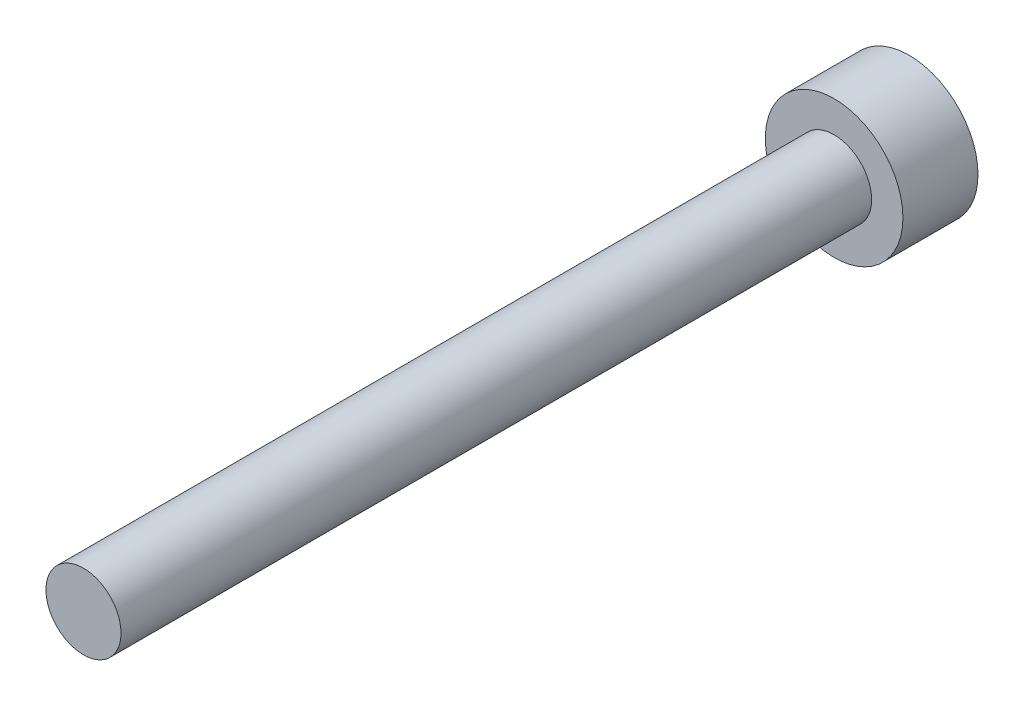
ISO-10303-21;
HEADER;
FILE_DESCRIPTION(('STEP AP214'),'2;1');
FILE_NAME('part.step','',(''),(''),'','','');
FILE_SCHEMA(('AUTOMOTIVE_DESIGN { 1 0 10303 214 1 1 1 1 }'));
ENDSEC;
DATA;
#1=APPLICATION_CONTEXT('core data for automotive mechanical design processes');
#2=APPLICATION_PROTOCOL_DEFINITION('international standard','automotive_design',2000,#1);
#3=PRODUCT_CONTEXT('',#1,'mechanical');
#4=PRODUCT('Part','Part','',(#3));
#5=PRODUCT_RELATED_PRODUCT_CATEGORY('part','',(#4));
#6=PRODUCT_DEFINITION_FORMATION('','',#4);
#7=PRODUCT_DEFINITION_CONTEXT('part definition',#1,'design');
#8=PRODUCT_DEFINITION('design','',#6,#7);
#9=PRODUCT_DEFINITION_SHAPE('','',#8);
#10=(LENGTH_UNIT() NAMED_UNIT(*) SI_UNIT(.MILLI.,.METRE.));
#11=(NAMED_UNIT(*) PLANE_ANGLE_UNIT() SI_UNIT($,.RADIAN.));
#12=(NAMED_UNIT(*) SI_UNIT($,.STERADIAN.) SOLID_ANGLE_UNIT());
#13=UNCERTAINTY_MEASURE_WITH_UNIT(LENGTH_MEASURE(1.E-05),#10,'distance_accuracy_value','');
#14=(GEOMETRIC_REPRESENTATION_CONTEXT(3) GLOBAL_UNCERTAINTY_ASSIGNED_CONTEXT((#13)) GLOBAL_UNIT_ASSIGNED_CONTEXT((#10,
#11,#12)) REPRESENTATION_CONTEXT('',''));
#15=CARTESIAN_POINT('',(0.,0.,0.));
#16=DIRECTION('',(0.,0.,1.));
#17=DIRECTION('',(1.,0.,0.));
#18=AXIS2_PLACEMENT_3D('',#15,#16,#17);
#19=CARTESIAN_POINT('',(0.,0.,-3.));
#20=DIRECTION('',(0.,0.,1.));
#21=DIRECTION('',(1.,0.,0.));
#22=AXIS2_PLACEMENT_3D('',#19,#20,#21);
#23=PLANE('',#22);
#24=CARTESIAN_POINT('',(0.,0.,-3.));
#25=DIRECTION('',(0.,0.,1.));
#26=DIRECTION('',(1.,0.,0.));
#27=AXIS2_PLACEMENT_3D('',#24,#25,#26);
#28=CIRCLE('',#27,2.75);
#29=CARTESIAN_POINT('',(2.75,0.,-3.));
#30=VERTEX_POINT('',#29);
#31=EDGE_CURVE('E111',#30,#30,#28,.T.);
#32=ORIENTED_EDGE('',*,*,#31,.F.);
#33=EDGE_LOOP('',(#32));
#34=FACE_BOUND('',#33,.T.);
#35=DIRECTION('',(-0.5,-0.866025403784439,0.));
#36=VECTOR('',#35,1.);
#37=CARTESIAN_POINT('',(1.08253175473055,-0.625,-3.));
#38=LINE('',#37,#36);
#39=CARTESIAN_POINT('',(1.44337567297406,0.,-3.));
#40=VERTEX_POINT('',#39);
#41=CARTESIAN_POINT('',(0.721687836487032,-1.25,-3.));
#42=VERTEX_POINT('',#41);
#43=EDGE_CURVE('E11',#40,#42,#38,.T.);
#44=ORIENTED_EDGE('',*,*,#43,.F.);
#45=DIRECTION('',(0.5,-0.866025403784439,0.));
#46=VECTOR('',#45,1.);
#47=CARTESIAN_POINT('',(1.08253175473055,0.625,-3.));
#48=LINE('',#47,#46);
#49=CARTESIAN_POINT('',(0.721687836487032,1.25,-3.));
#50=VERTEX_POINT('',#49);
#51=EDGE_CURVE('E50',#50,#40,#48,.T.);
#52=ORIENTED_EDGE('',*,*,#51,.F.);
#53=DIRECTION('',(1.,0.,0.));
#54=VECTOR('',#53,1.);
#55=CARTESIAN_POINT('',(0.,1.25,-3.));
#56=LINE('',#55,#54);
#57=CARTESIAN_POINT('',(-0.721687836487032,1.25,-3.));
#58=VERTEX_POINT('',#57);
#59=EDGE_CURVE('E132',#58,#50,#56,.T.);
#60=ORIENTED_EDGE('',*,*,#59,.F.);
#61=DIRECTION('',(0.5,0.866025403784439,0.));
#62=VECTOR('',#61,1.);
#63=CARTESIAN_POINT('',(-1.08253175473055,0.625,-3.));
#64=LINE('',#63,#62);
#65=CARTESIAN_POINT('',(-1.44337567297406,0.,-3.));
#66=VERTEX_POINT('',#65);
#67=EDGE_CURVE('E126',#66,#58,#64,.T.);
#68=ORIENTED_EDGE('',*,*,#67,.F.);
#69=DIRECTION('',(-0.5,0.866025403784439,0.));
#70=VECTOR('',#69,1.);
#71=CARTESIAN_POINT('',(-1.08253175473055,-0.624999999999999,-3.));
#72=LINE('',#71,#70);
#73=CARTESIAN_POINT('',(-0.721687836487033,-1.25,-3.));
#74=VERTEX_POINT('',#73);
#75=EDGE_CURVE('E130',#74,#66,#72,.T.);
#76=ORIENTED_EDGE('',*,*,#75,.F.);
#77=DIRECTION('',(-1.,0.,0.));
#78=VECTOR('',#77,1.);
#79=CARTESIAN_POINT('',(0.,-1.25,-3.));
#80=LINE('',#79,#78);
#81=EDGE_CURVE('E119',#42,#74,#80,.T.);
#82=ORIENTED_EDGE('',*,*,#81,.F.);
#83=EDGE_LOOP('',(#44,#52,#60,#68,#76,#82));
#84=FACE_BOUND('',#83,.T.);
#85=ADVANCED_FACE('F39',(#34,#84),#23,.F.);
#86=CARTESIAN_POINT('',(0.,0.,0.));
#87=DIRECTION('',(0.,0.,-1.));
#88=DIRECTION('',(-1.,0.,0.));
#89=AXIS2_PLACEMENT_3D('',#86,#87,#88);
#90=CYLINDRICAL_SURFACE('',#89,2.75);
#91=CARTESIAN_POINT('',(0.,0.,0.));
#92=DIRECTION('',(0.,0.,1.));
#93=DIRECTION('',(1.,0.,0.));
#94=AXIS2_PLACEMENT_3D('',#91,#92,#93);
#95=CIRCLE('',#94,2.75);
#96=CARTESIAN_POINT('',(2.75,0.,0.));
#97=VERTEX_POINT('',#96);
#98=EDGE_CURVE('E122',#97,#97,#95,.T.);
#99=ORIENTED_EDGE('',*,*,#98,.F.);
#100=EDGE_LOOP('',(#99));
#101=FACE_BOUND('',#100,.T.);
#102=ORIENTED_EDGE('',*,*,#31,.T.);
#103=EDGE_LOOP('',(#102));
#104=FACE_BOUND('',#103,.T.);
#105=ADVANCED_FACE('F41',(#101,#104),#90,.T.);
#106=CARTESIAN_POINT('',(0.,0.,0.));
#107=DIRECTION('',(0.,0.,1.));
#108=DIRECTION('',(1.,0.,0.));
#109=AXIS2_PLACEMENT_3D('',#106,#107,#108);
#110=PLANE('',#109);
#111=CARTESIAN_POINT('',(0.,0.,0.));
#112=DIRECTION('',(0.,0.,1.));
#113=DIRECTION('',(1.,0.,0.));
#114=AXIS2_PLACEMENT_3D('',#111,#112,#113);
#115=CIRCLE('',#114,1.5);
#116=CARTESIAN_POINT('',(1.5,0.,0.));
#117=VERTEX_POINT('',#116);
#118=EDGE_CURVE('E120',#117,#117,#115,.T.);
#119=ORIENTED_EDGE('',*,*,#118,.F.);
#120=EDGE_LOOP('',(#119));
#121=FACE_BOUND('',#120,.T.);
#122=ORIENTED_EDGE('',*,*,#98,.T.);
#123=EDGE_LOOP('',(#122));
#124=FACE_BOUND('',#123,.T.);
#125=ADVANCED_FACE('F178',(#121,#124),#110,.T.);
#126=CARTESIAN_POINT('',(0.,0.,30.));
#127=DIRECTION('',(0.,0.,-1.));
#128=DIRECTION('',(-1.,0.,0.));
#129=AXIS2_PLACEMENT_3D('',#126,#127,#128);
#130=CYLINDRICAL_SURFACE('',#129,1.5);
#131=CARTESIAN_POINT('',(0.,0.,30.));
#132=DIRECTION('',(0.,0.,1.));
#133=DIRECTION('',(1.,0.,0.));
#134=AXIS2_PLACEMENT_3D('',#131,#132,#133);
#135=CIRCLE('',#134,1.5);
#136=CARTESIAN_POINT('',(1.5,0.,30.));
#137=VERTEX_POINT('',#136);
#138=EDGE_CURVE('E110',#137,#137,#135,.T.);
#139=ORIENTED_EDGE('',*,*,#138,.F.);
#140=EDGE_LOOP('',(#139));
#141=FACE_BOUND('',#140,.T.);
#142=ORIENTED_EDGE('',*,*,#118,.T.);
#143=EDGE_LOOP('',(#142));
#144=FACE_BOUND('',#143,.T.);
#145=ADVANCED_FACE('F183',(#141,#144),#130,.T.);
#146=CARTESIAN_POINT('',(0.,0.,30.));
#147=DIRECTION('',(0.,0.,1.));
#148=DIRECTION('',(1.,0.,0.));
#149=AXIS2_PLACEMENT_3D('',#146,#147,#148);
#150=PLANE('',#149);
#151=ORIENTED_EDGE('',*,*,#138,.T.);
#152=EDGE_LOOP('',(#151));
#153=FACE_BOUND('',#152,.T.);
#154=ADVANCED_FACE('F189',(#153),#150,.T.);
#155=CARTESIAN_POINT('',(0.721687836487032,-1.25,-1.35));
#156=DIRECTION('',(-0.866025403784439,0.5,0.));
#157=DIRECTION('',(-0.5,-0.866025403784439,0.));
#158=AXIS2_PLACEMENT_3D('',#155,#156,#157);
#159=PLANE('',#158);
#160=ORIENTED_EDGE('',*,*,#43,.T.);
#161=DIRECTION('',(0.,0.,-1.));
#162=VECTOR('',#161,1.);
#163=CARTESIAN_POINT('',(0.721687836487032,-1.25,-1.35));
#164=LINE('',#163,#162);
#165=CARTESIAN_POINT('',(0.721687836487032,-1.25,-1.35));
#166=VERTEX_POINT('',#165);
#167=EDGE_CURVE('E53',#166,#42,#164,.T.);
#168=ORIENTED_EDGE('',*,*,#167,.F.);
#169=DIRECTION('',(0.5,0.866025403784439,0.));
#170=VECTOR('',#169,1.);
#171=CARTESIAN_POINT('',(0.721687836487032,-1.25,-1.35));
#172=LINE('',#171,#170);
#173=CARTESIAN_POINT('',(1.44337567297406,0.,-1.35));
#174=VERTEX_POINT('',#173);
#175=EDGE_CURVE('E98',#166,#174,#172,.T.);
#176=ORIENTED_EDGE('',*,*,#175,.T.);
#177=DIRECTION('',(0.,0.,-1.));
#178=VECTOR('',#177,1.);
#179=CARTESIAN_POINT('',(1.44337567297406,0.,-1.35));
#180=LINE('',#179,#178);
#181=EDGE_CURVE('E101',#174,#40,#180,.T.);
#182=ORIENTED_EDGE('',*,*,#181,.T.);
#183=EDGE_LOOP('',(#160,#168,#176,#182));
#184=FACE_BOUND('',#183,.T.);
#185=ADVANCED_FACE('F105',(#184),#159,.T.);
#186=CARTESIAN_POINT('',(1.44337567297406,0.,-1.35));
#187=DIRECTION('',(-0.866025403784439,-0.5,0.));
#188=DIRECTION('',(0.5,-0.866025403784439,0.));
#189=AXIS2_PLACEMENT_3D('',#186,#187,#188);
#190=PLANE('',#189);
#191=ORIENTED_EDGE('',*,*,#51,.T.);
#192=ORIENTED_EDGE('',*,*,#181,.F.);
#193=DIRECTION('',(-0.5,0.866025403784439,0.));
#194=VECTOR('',#193,1.);
#195=CARTESIAN_POINT('',(1.44337567297406,0.,-1.35));
#196=LINE('',#195,#194);
#197=CARTESIAN_POINT('',(0.721687836487032,1.25,-1.35));
#198=VERTEX_POINT('',#197);
#199=EDGE_CURVE('E95',#174,#198,#196,.T.);
#200=ORIENTED_EDGE('',*,*,#199,.T.);
#201=DIRECTION('',(0.,0.,-1.));
#202=VECTOR('',#201,1.);
#203=CARTESIAN_POINT('',(0.721687836487032,1.25,-1.35));
#204=LINE('',#203,#202);
#205=EDGE_CURVE('E108',#198,#50,#204,.T.);
#206=ORIENTED_EDGE('',*,*,#205,.T.);
#207=EDGE_LOOP('',(#191,#192,#200,#206));
#208=FACE_BOUND('',#207,.T.);
#209=ADVANCED_FACE('F106',(#208),#190,.T.);
#210=CARTESIAN_POINT('',(0.721687836487032,1.25,-1.35));
#211=DIRECTION('',(0.,-1.,0.));
#212=DIRECTION('',(1.,0.,0.));
#213=AXIS2_PLACEMENT_3D('',#210,#211,#212);
#214=PLANE('',#213);
#215=ORIENTED_EDGE('',*,*,#59,.T.);
#216=ORIENTED_EDGE('',*,*,#205,.F.);
#217=DIRECTION('',(-1.,0.,0.));
#218=VECTOR('',#217,1.);
#219=CARTESIAN_POINT('',(0.721687836487032,1.25,-1.35));
#220=LINE('',#219,#218);
#221=CARTESIAN_POINT('',(-0.721687836487032,1.25,-1.35));
#222=VERTEX_POINT('',#221);
#223=EDGE_CURVE('E96',#198,#222,#220,.T.);
#224=ORIENTED_EDGE('',*,*,#223,.T.);
#225=DIRECTION('',(0.,0.,-1.));
#226=VECTOR('',#225,1.);
#227=CARTESIAN_POINT('',(-0.721687836487032,1.25,-1.35));
#228=LINE('',#227,#226);
#229=EDGE_CURVE('E113',#222,#58,#228,.T.);
#230=ORIENTED_EDGE('',*,*,#229,.T.);
#231=EDGE_LOOP('',(#215,#216,#224,#230));
#232=FACE_BOUND('',#231,.T.);
#233=ADVANCED_FACE('F133',(#232),#214,.T.);
#234=CARTESIAN_POINT('',(-0.721687836487032,1.25,-1.35));
#235=DIRECTION('',(0.866025403784439,-0.5,0.));
#236=DIRECTION('',(0.5,0.866025403784439,0.));
#237=AXIS2_PLACEMENT_3D('',#234,#235,#236);
#238=PLANE('',#237);
#239=ORIENTED_EDGE('',*,*,#67,.T.);
#240=ORIENTED_EDGE('',*,*,#229,.F.);
#241=DIRECTION('',(-0.5,-0.866025403784439,0.));
#242=VECTOR('',#241,1.);
#243=CARTESIAN_POINT('',(-0.721687836487032,1.25,-1.35));
#244=LINE('',#243,#242);
#245=CARTESIAN_POINT('',(-1.44337567297406,0.,-1.35));
#246=VERTEX_POINT('',#245);
#247=EDGE_CURVE('E159',#222,#246,#244,.T.);
#248=ORIENTED_EDGE('',*,*,#247,.T.);
#249=DIRECTION('',(0.,0.,-1.));
#250=VECTOR('',#249,1.);
#251=CARTESIAN_POINT('',(-1.44337567297406,0.,-1.35));
#252=LINE('',#251,#250);
#253=EDGE_CURVE('E152',#246,#66,#252,.T.);
#254=ORIENTED_EDGE('',*,*,#253,.T.);
#255=EDGE_LOOP('',(#239,#240,#248,#254));
#256=FACE_BOUND('',#255,.T.);
#257=ADVANCED_FACE('F162',(#256),#238,.T.);
#258=CARTESIAN_POINT('',(-1.44337567297406,0.,-1.35));
#259=DIRECTION('',(0.866025403784439,0.5,0.));
#260=DIRECTION('',(-0.5,0.866025403784439,0.));
#261=AXIS2_PLACEMENT_3D('',#258,#259,#260);
#262=PLANE('',#261);
#263=ORIENTED_EDGE('',*,*,#75,.T.);
#264=ORIENTED_EDGE('',*,*,#253,.F.);
#265=DIRECTION('',(0.5,-0.866025403784439,0.));
#266=VECTOR('',#265,1.);
#267=CARTESIAN_POINT('',(-1.44337567297406,0.,-1.35));
#268=LINE('',#267,#266);
#269=CARTESIAN_POINT('',(-0.721687836487033,-1.25,-1.35));
#270=VERTEX_POINT('',#269);
#271=EDGE_CURVE('E148',#246,#270,#268,.T.);
#272=ORIENTED_EDGE('',*,*,#271,.T.);
#273=DIRECTION('',(0.,0.,-1.));
#274=VECTOR('',#273,1.);
#275=CARTESIAN_POINT('',(-0.721687836487033,-1.25,-1.35));
#276=LINE('',#275,#274);
#277=EDGE_CURVE('E144',#270,#74,#276,.T.);
#278=ORIENTED_EDGE('',*,*,#277,.T.);
#279=EDGE_LOOP('',(#263,#264,#272,#278));
#280=FACE_BOUND('',#279,.T.);
#281=ADVANCED_FACE('F147',(#280),#262,.T.);
#282=CARTESIAN_POINT('',(-0.721687836487033,-1.25,-1.35));
#283=DIRECTION('',(0.,1.,0.));
#284=DIRECTION('',(-1.,0.,0.));
#285=AXIS2_PLACEMENT_3D('',#282,#283,#284);
#286=PLANE('',#285);
#287=ORIENTED_EDGE('',*,*,#81,.T.);
#288=ORIENTED_EDGE('',*,*,#277,.F.);
#289=DIRECTION('',(1.,0.,0.));
#290=VECTOR('',#289,1.);
#291=CARTESIAN_POINT('',(-0.721687836487033,-1.25,-1.35));
#292=LINE('',#291,#290);
#293=EDGE_CURVE('E151',#270,#166,#292,.T.);
#294=ORIENTED_EDGE('',*,*,#293,.T.);
#295=ORIENTED_EDGE('',*,*,#167,.T.);
#296=EDGE_LOOP('',(#287,#288,#294,#295));
#297=FACE_BOUND('',#296,.T.);
#298=ADVANCED_FACE('F141',(#297),#286,.T.);
#299=CARTESIAN_POINT('',(0.,0.,-1.35));
#300=DIRECTION('',(0.,0.,1.));
#301=DIRECTION('',(1.,0.,0.));
#302=AXIS2_PLACEMENT_3D('',#299,#300,#301);
#303=PLANE('',#302);
#304=ORIENTED_EDGE('',*,*,#175,.F.);
#305=ORIENTED_EDGE('',*,*,#293,.F.);
#306=ORIENTED_EDGE('',*,*,#271,.F.);
#307=ORIENTED_EDGE('',*,*,#247,.F.);
#308=ORIENTED_EDGE('',*,*,#223,.F.);
#309=ORIENTED_EDGE('',*,*,#199,.F.);
#310=EDGE_LOOP('',(#304,#305,#306,#307,#308,#309));
#311=FACE_BOUND('',#310,.T.);
#312=ADVANCED_FACE('F94',(#311),#303,.F.);
#313=CLOSED_SHELL('',(#85,#105,#125,#145,#154,#185,#209,#233,#257,#281,#298,#312));
#314=MANIFOLD_SOLID_BREP('B2',#313);
#315=ADVANCED_BREP_SHAPE_REPRESENTATION('',(#18,#314),#14);
#316=SHAPE_DEFINITION_REPRESENTATION(#9,#315);
ENDSEC;
END-ISO-10303-21;
